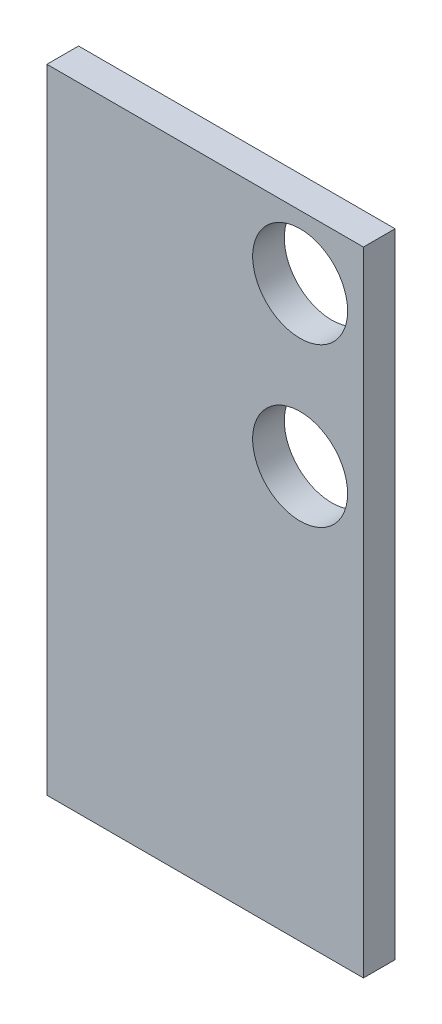
ISO-10303-21;
HEADER;
FILE_DESCRIPTION(('STEP AP214'),'2;1');
FILE_NAME('part.step','',(''),(''),'','','');
FILE_SCHEMA(('AUTOMOTIVE_DESIGN { 1 0 10303 214 1 1 1 1 }'));
ENDSEC;
DATA;
#1=APPLICATION_CONTEXT('core data for automotive mechanical design processes');
#2=APPLICATION_PROTOCOL_DEFINITION('international standard','automotive_design',2000,#1);
#3=PRODUCT_CONTEXT('',#1,'mechanical');
#4=PRODUCT('Part','Part','',(#3));
#5=PRODUCT_RELATED_PRODUCT_CATEGORY('part','',(#4));
#6=PRODUCT_DEFINITION_FORMATION('','',#4);
#7=PRODUCT_DEFINITION_CONTEXT('part definition',#1,'design');
#8=PRODUCT_DEFINITION('design','',#6,#7);
#9=PRODUCT_DEFINITION_SHAPE('','',#8);
#10=(LENGTH_UNIT() NAMED_UNIT(*) SI_UNIT(.MILLI.,.METRE.));
#11=(NAMED_UNIT(*) PLANE_ANGLE_UNIT() SI_UNIT($,.RADIAN.));
#12=(NAMED_UNIT(*) SI_UNIT($,.STERADIAN.) SOLID_ANGLE_UNIT());
#13=UNCERTAINTY_MEASURE_WITH_UNIT(LENGTH_MEASURE(1.E-05),#10,'distance_accuracy_value','');
#14=(GEOMETRIC_REPRESENTATION_CONTEXT(3) GLOBAL_UNCERTAINTY_ASSIGNED_CONTEXT((#13)) GLOBAL_UNIT_ASSIGNED_CONTEXT((#10,
#11,#12)) REPRESENTATION_CONTEXT('',''));
#15=CARTESIAN_POINT('',(0.,0.,0.));
#16=DIRECTION('',(0.,0.,1.));
#17=DIRECTION('',(1.,0.,0.));
#18=AXIS2_PLACEMENT_3D('',#15,#16,#17);
#19=CARTESIAN_POINT('',(0.,0.,1.));
#20=DIRECTION('',(0.,0.,-1.));
#21=DIRECTION('',(-1.,0.,0.));
#22=AXIS2_PLACEMENT_3D('',#19,#20,#21);
#23=PLANE('',#22);
#24=DIRECTION('',(0.,-1.,0.));
#25=VECTOR('',#24,1.);
#26=CARTESIAN_POINT('',(-2.90566037735849,10.,1.));
#27=LINE('',#26,#25);
#28=CARTESIAN_POINT('',(-2.90566037735849,10.,1.));
#29=VERTEX_POINT('',#28);
#30=CARTESIAN_POINT('',(-2.90566037735849,-10.,1.));
#31=VERTEX_POINT('',#30);
#32=EDGE_CURVE('E88',#29,#31,#27,.T.);
#33=ORIENTED_EDGE('',*,*,#32,.T.);
#34=DIRECTION('',(1.,0.,0.));
#35=VECTOR('',#34,1.);
#36=CARTESIAN_POINT('',(7.09433962264151,-10.,1.));
#37=LINE('',#36,#35);
#38=CARTESIAN_POINT('',(7.09433962264151,-10.,1.));
#39=VERTEX_POINT('',#38);
#40=EDGE_CURVE('E83',#31,#39,#37,.T.);
#41=ORIENTED_EDGE('',*,*,#40,.T.);
#42=DIRECTION('',(0.,1.,0.));
#43=VECTOR('',#42,1.);
#44=CARTESIAN_POINT('',(7.09433962264151,10.,1.));
#45=LINE('',#44,#43);
#46=CARTESIAN_POINT('',(7.09433962264151,10.,1.));
#47=VERTEX_POINT('',#46);
#48=EDGE_CURVE('E86',#39,#47,#45,.T.);
#49=ORIENTED_EDGE('',*,*,#48,.T.);
#50=DIRECTION('',(-1.,0.,0.));
#51=VECTOR('',#50,1.);
#52=CARTESIAN_POINT('',(7.09433962264151,10.,1.));
#53=LINE('',#52,#51);
#54=EDGE_CURVE('E53',#47,#29,#53,.T.);
#55=ORIENTED_EDGE('',*,*,#54,.T.);
#56=EDGE_LOOP('',(#33,#41,#49,#55));
#57=FACE_BOUND('',#56,.T.);
#58=CARTESIAN_POINT('',(5.09433962264151,8.,1.));
#59=DIRECTION('',(0.,0.,1.));
#60=DIRECTION('',(1.,0.,0.));
#61=AXIS2_PLACEMENT_3D('',#58,#59,#60);
#62=CIRCLE('',#61,1.5);
#63=CARTESIAN_POINT('',(6.59433962264151,8.,1.));
#64=VERTEX_POINT('',#63);
#65=EDGE_CURVE('E103',#64,#64,#62,.T.);
#66=ORIENTED_EDGE('',*,*,#65,.F.);
#67=EDGE_LOOP('',(#66));
#68=FACE_BOUND('',#67,.T.);
#69=CARTESIAN_POINT('',(5.09433962264151,3.,1.));
#70=DIRECTION('',(0.,0.,1.));
#71=DIRECTION('',(1.,0.,0.));
#72=AXIS2_PLACEMENT_3D('',#69,#70,#71);
#73=CIRCLE('',#72,1.5);
#74=CARTESIAN_POINT('',(6.59433962264151,3.,1.));
#75=VERTEX_POINT('',#74);
#76=EDGE_CURVE('E118',#75,#75,#73,.T.);
#77=ORIENTED_EDGE('',*,*,#76,.F.);
#78=EDGE_LOOP('',(#77));
#79=FACE_BOUND('',#78,.T.);
#80=ADVANCED_FACE('F36',(#57,#68,#79),#23,.F.);
#81=CARTESIAN_POINT('',(0.,0.,0.));
#82=DIRECTION('',(0.,0.,-1.));
#83=DIRECTION('',(-1.,0.,0.));
#84=AXIS2_PLACEMENT_3D('',#81,#82,#83);
#85=PLANE('',#84);
#86=CARTESIAN_POINT('',(5.09433962264151,8.,0.));
#87=DIRECTION('',(0.,0.,1.));
#88=DIRECTION('',(1.,0.,0.));
#89=AXIS2_PLACEMENT_3D('',#86,#87,#88);
#90=CIRCLE('',#89,1.5);
#91=CARTESIAN_POINT('',(6.59433962264151,8.,0.));
#92=VERTEX_POINT('',#91);
#93=EDGE_CURVE('E115',#92,#92,#90,.T.);
#94=ORIENTED_EDGE('',*,*,#93,.T.);
#95=EDGE_LOOP('',(#94));
#96=FACE_BOUND('',#95,.T.);
#97=DIRECTION('',(0.,-1.,0.));
#98=VECTOR('',#97,1.);
#99=CARTESIAN_POINT('',(-2.90566037735849,10.,0.));
#100=LINE('',#99,#98);
#101=CARTESIAN_POINT('',(-2.90566037735849,10.,0.));
#102=VERTEX_POINT('',#101);
#103=CARTESIAN_POINT('',(-2.90566037735849,-10.,0.));
#104=VERTEX_POINT('',#103);
#105=EDGE_CURVE('E100',#102,#104,#100,.T.);
#106=ORIENTED_EDGE('',*,*,#105,.F.);
#107=DIRECTION('',(-1.,0.,0.));
#108=VECTOR('',#107,1.);
#109=CARTESIAN_POINT('',(7.09433962264151,10.,0.));
#110=LINE('',#109,#108);
#111=CARTESIAN_POINT('',(7.09433962264151,10.,0.));
#112=VERTEX_POINT('',#111);
#113=EDGE_CURVE('E76',#112,#102,#110,.T.);
#114=ORIENTED_EDGE('',*,*,#113,.F.);
#115=DIRECTION('',(0.,1.,0.));
#116=VECTOR('',#115,1.);
#117=CARTESIAN_POINT('',(7.09433962264151,10.,0.));
#118=LINE('',#117,#116);
#119=CARTESIAN_POINT('',(7.09433962264151,-10.,0.));
#120=VERTEX_POINT('',#119);
#121=EDGE_CURVE('E70',#120,#112,#118,.T.);
#122=ORIENTED_EDGE('',*,*,#121,.F.);
#123=DIRECTION('',(1.,0.,0.));
#124=VECTOR('',#123,1.);
#125=CARTESIAN_POINT('',(7.09433962264151,-10.,0.));
#126=LINE('',#125,#124);
#127=EDGE_CURVE('E92',#104,#120,#126,.T.);
#128=ORIENTED_EDGE('',*,*,#127,.F.);
#129=EDGE_LOOP('',(#106,#114,#122,#128));
#130=FACE_BOUND('',#129,.T.);
#131=CARTESIAN_POINT('',(5.09433962264151,3.,0.));
#132=DIRECTION('',(0.,0.,1.));
#133=DIRECTION('',(1.,0.,0.));
#134=AXIS2_PLACEMENT_3D('',#131,#132,#133);
#135=CIRCLE('',#134,1.5);
#136=CARTESIAN_POINT('',(6.59433962264151,3.,0.));
#137=VERTEX_POINT('',#136);
#138=EDGE_CURVE('E121',#137,#137,#135,.T.);
#139=ORIENTED_EDGE('',*,*,#138,.T.);
#140=EDGE_LOOP('',(#139));
#141=FACE_BOUND('',#140,.T.);
#142=ADVANCED_FACE('F111',(#96,#130,#141),#85,.T.);
#143=CARTESIAN_POINT('',(-2.90566037735849,10.,1.));
#144=DIRECTION('',(1.,0.,0.));
#145=DIRECTION('',(0.,1.,0.));
#146=AXIS2_PLACEMENT_3D('',#143,#144,#145);
#147=PLANE('',#146);
#148=ORIENTED_EDGE('',*,*,#105,.T.);
#149=DIRECTION('',(0.,0.,-1.));
#150=VECTOR('',#149,1.);
#151=CARTESIAN_POINT('',(-2.90566037735849,-10.,1.));
#152=LINE('',#151,#150);
#153=EDGE_CURVE('E11',#31,#104,#152,.T.);
#154=ORIENTED_EDGE('',*,*,#153,.F.);
#155=ORIENTED_EDGE('',*,*,#32,.F.);
#156=DIRECTION('',(0.,0.,-1.));
#157=VECTOR('',#156,1.);
#158=CARTESIAN_POINT('',(-2.90566037735849,10.,1.));
#159=LINE('',#158,#157);
#160=EDGE_CURVE('E96',#29,#102,#159,.T.);
#161=ORIENTED_EDGE('',*,*,#160,.T.);
#162=EDGE_LOOP('',(#148,#154,#155,#161));
#163=FACE_BOUND('',#162,.T.);
#164=ADVANCED_FACE('F38',(#163),#147,.F.);
#165=CARTESIAN_POINT('',(7.09433962264151,-10.,1.));
#166=DIRECTION('',(0.,1.,0.));
#167=DIRECTION('',(-1.,0.,0.));
#168=AXIS2_PLACEMENT_3D('',#165,#166,#167);
#169=PLANE('',#168);
#170=ORIENTED_EDGE('',*,*,#127,.T.);
#171=DIRECTION('',(0.,0.,-1.));
#172=VECTOR('',#171,1.);
#173=CARTESIAN_POINT('',(7.09433962264151,-10.,1.));
#174=LINE('',#173,#172);
#175=EDGE_CURVE('E45',#39,#120,#174,.T.);
#176=ORIENTED_EDGE('',*,*,#175,.F.);
#177=ORIENTED_EDGE('',*,*,#40,.F.);
#178=ORIENTED_EDGE('',*,*,#153,.T.);
#179=EDGE_LOOP('',(#170,#176,#177,#178));
#180=FACE_BOUND('',#179,.T.);
#181=ADVANCED_FACE('F91',(#180),#169,.F.);
#182=CARTESIAN_POINT('',(7.09433962264151,10.,1.));
#183=DIRECTION('',(-1.,0.,0.));
#184=DIRECTION('',(0.,-1.,0.));
#185=AXIS2_PLACEMENT_3D('',#182,#183,#184);
#186=PLANE('',#185);
#187=ORIENTED_EDGE('',*,*,#121,.T.);
#188=DIRECTION('',(0.,0.,-1.));
#189=VECTOR('',#188,1.);
#190=CARTESIAN_POINT('',(7.09433962264151,10.,1.));
#191=LINE('',#190,#189);
#192=EDGE_CURVE('E93',#47,#112,#191,.T.);
#193=ORIENTED_EDGE('',*,*,#192,.F.);
#194=ORIENTED_EDGE('',*,*,#48,.F.);
#195=ORIENTED_EDGE('',*,*,#175,.T.);
#196=EDGE_LOOP('',(#187,#193,#194,#195));
#197=FACE_BOUND('',#196,.T.);
#198=ADVANCED_FACE('F94',(#197),#186,.F.);
#199=CARTESIAN_POINT('',(7.09433962264151,10.,1.));
#200=DIRECTION('',(0.,-1.,0.));
#201=DIRECTION('',(1.,0.,0.));
#202=AXIS2_PLACEMENT_3D('',#199,#200,#201);
#203=PLANE('',#202);
#204=ORIENTED_EDGE('',*,*,#113,.T.);
#205=ORIENTED_EDGE('',*,*,#160,.F.);
#206=ORIENTED_EDGE('',*,*,#54,.F.);
#207=ORIENTED_EDGE('',*,*,#192,.T.);
#208=EDGE_LOOP('',(#204,#205,#206,#207));
#209=FACE_BOUND('',#208,.T.);
#210=ADVANCED_FACE('F108',(#209),#203,.F.);
#211=CARTESIAN_POINT('',(5.09433962264151,8.,1.));
#212=DIRECTION('',(0.,0.,-1.));
#213=DIRECTION('',(-1.,0.,0.));
#214=AXIS2_PLACEMENT_3D('',#211,#212,#213);
#215=CYLINDRICAL_SURFACE('',#214,1.5);
#216=ORIENTED_EDGE('',*,*,#65,.T.);
#217=EDGE_LOOP('',(#216));
#218=FACE_BOUND('',#217,.T.);
#219=ORIENTED_EDGE('',*,*,#93,.F.);
#220=EDGE_LOOP('',(#219));
#221=FACE_BOUND('',#220,.T.);
#222=ADVANCED_FACE('F138',(#218,#221),#215,.F.);
#223=CARTESIAN_POINT('',(5.09433962264151,3.,1.));
#224=DIRECTION('',(0.,0.,-1.));
#225=DIRECTION('',(-1.,0.,0.));
#226=AXIS2_PLACEMENT_3D('',#223,#224,#225);
#227=CYLINDRICAL_SURFACE('',#226,1.5);
#228=ORIENTED_EDGE('',*,*,#76,.T.);
#229=EDGE_LOOP('',(#228));
#230=FACE_BOUND('',#229,.T.);
#231=ORIENTED_EDGE('',*,*,#138,.F.);
#232=EDGE_LOOP('',(#231));
#233=FACE_BOUND('',#232,.T.);
#234=ADVANCED_FACE('F127',(#230,#233),#227,.F.);
#235=CLOSED_SHELL('',(#80,#142,#164,#181,#198,#210,#222,#234));
#236=MANIFOLD_SOLID_BREP('B2',#235);
#237=ADVANCED_BREP_SHAPE_REPRESENTATION('',(#18,#236),#14);
#238=SHAPE_DEFINITION_REPRESENTATION(#9,#237);
ENDSEC;
END-ISO-10303-21;
